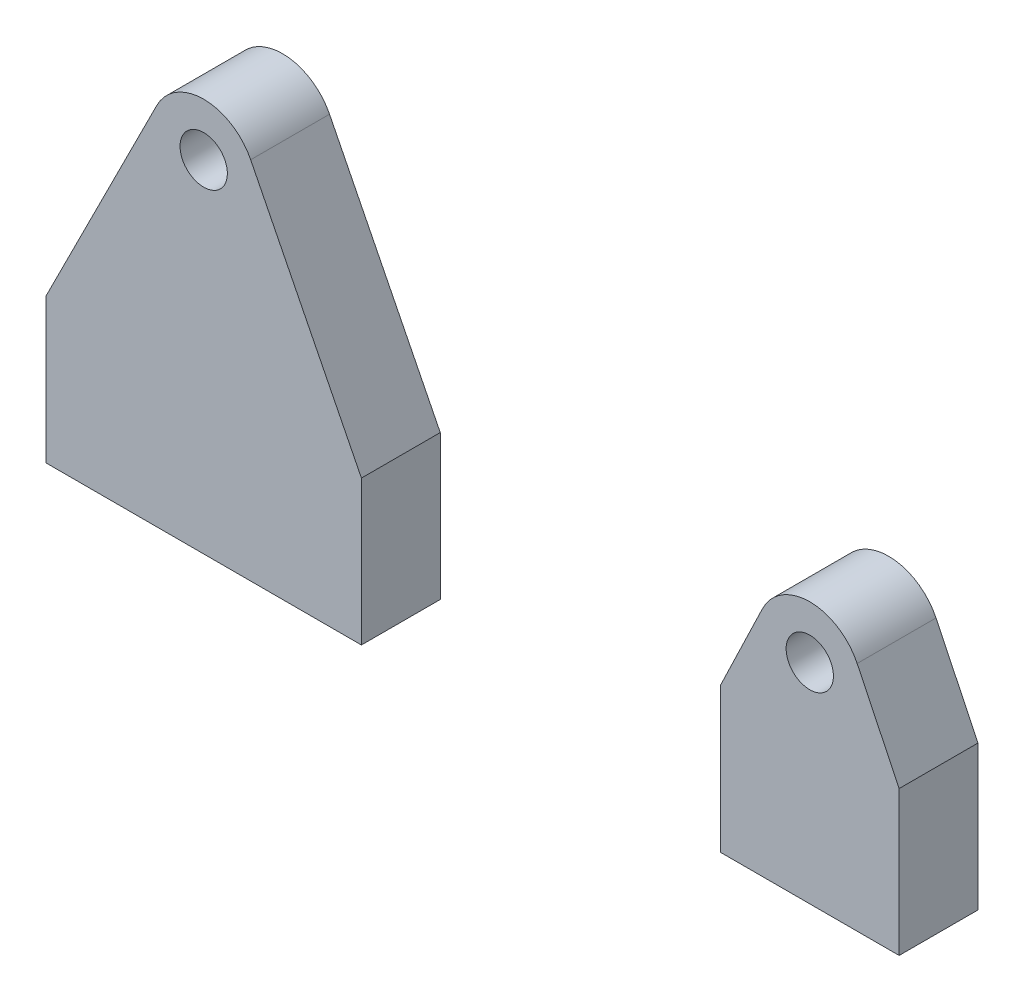
ISO-10303-21;
HEADER;
FILE_DESCRIPTION(('STEP AP214'),'2;1');
FILE_NAME('part.step','',(''),(''),'','','');
FILE_SCHEMA(('AUTOMOTIVE_DESIGN { 1 0 10303 214 1 1 1 1 }'));
ENDSEC;
DATA;
#1=APPLICATION_CONTEXT('core data for automotive mechanical design processes');
#2=APPLICATION_PROTOCOL_DEFINITION('international standard','automotive_design',2000,#1);
#3=PRODUCT_CONTEXT('',#1,'mechanical');
#4=PRODUCT('Part','Part','',(#3));
#5=PRODUCT_RELATED_PRODUCT_CATEGORY('part','',(#4));
#6=PRODUCT_DEFINITION_FORMATION('','',#4);
#7=PRODUCT_DEFINITION_CONTEXT('part definition',#1,'design');
#8=PRODUCT_DEFINITION('design','',#6,#7);
#9=PRODUCT_DEFINITION_SHAPE('','',#8);
#10=(LENGTH_UNIT() NAMED_UNIT(*) SI_UNIT(.MILLI.,.METRE.));
#11=(NAMED_UNIT(*) PLANE_ANGLE_UNIT() SI_UNIT($,.RADIAN.));
#12=(NAMED_UNIT(*) SI_UNIT($,.STERADIAN.) SOLID_ANGLE_UNIT());
#13=UNCERTAINTY_MEASURE_WITH_UNIT(LENGTH_MEASURE(1.E-05),#10,'distance_accuracy_value','');
#14=(GEOMETRIC_REPRESENTATION_CONTEXT(3) GLOBAL_UNCERTAINTY_ASSIGNED_CONTEXT((#13)) GLOBAL_UNIT_ASSIGNED_CONTEXT((#10,
#11,#12)) REPRESENTATION_CONTEXT('',''));
#15=CARTESIAN_POINT('',(0.,0.,0.));
#16=DIRECTION('',(0.,0.,1.));
#17=DIRECTION('',(1.,0.,0.));
#18=AXIS2_PLACEMENT_3D('',#15,#16,#17);
#19=CARTESIAN_POINT('',(-242.040783087782,121.65323336903,-75.0000000000001));
#20=DIRECTION('',(-0.893490787116088,0.449081521929675,0.));
#21=DIRECTION('',(-0.449081521929675,-0.893490787116088,0.));
#22=AXIS2_PLACEMENT_3D('',#19,#20,#21);
#23=PLANE('',#22);
#24=DIRECTION('',(-0.449081521929675,-0.893490787116088,0.));
#25=VECTOR('',#24,1.);
#26=CARTESIAN_POINT('',(-242.040783087782,121.65323336903,-60.0000000000001));
#27=LINE('',#26,#25);
#28=CARTESIAN_POINT('',(-560.237622534689,-511.429916687164,-60.));
#29=VERTEX_POINT('',#28);
#30=CARTESIAN_POINT('',(-581.302714663528,-553.340939135816,-60.));
#31=VERTEX_POINT('',#30);
#32=EDGE_CURVE('E141',#29,#31,#27,.T.);
#33=ORIENTED_EDGE('',*,*,#32,.F.);
#34=DIRECTION('',(0.,0.,1.));
#35=VECTOR('',#34,1.);
#36=CARTESIAN_POINT('',(-560.237622534689,-511.429916687164,-75.));
#37=LINE('',#36,#35);
#38=CARTESIAN_POINT('',(-560.237622534689,-511.429916687164,-75.));
#39=VERTEX_POINT('',#38);
#40=EDGE_CURVE('E12',#39,#29,#37,.T.);
#41=ORIENTED_EDGE('',*,*,#40,.F.);
#42=DIRECTION('',(-0.449081521929675,-0.893490787116088,0.));
#43=VECTOR('',#42,1.);
#44=CARTESIAN_POINT('',(-242.040783087782,121.65323336903,-75.0000000000001));
#45=LINE('',#44,#43);
#46=CARTESIAN_POINT('',(-581.302714663528,-553.340939135816,-75.));
#47=VERTEX_POINT('',#46);
#48=EDGE_CURVE('E157',#39,#47,#45,.T.);
#49=ORIENTED_EDGE('',*,*,#48,.T.);
#50=DIRECTION('',(0.,0.,1.));
#51=VECTOR('',#50,1.);
#52=CARTESIAN_POINT('',(-581.302714663528,-553.340939135816,-75.));
#53=LINE('',#52,#51);
#54=EDGE_CURVE('E70',#47,#31,#53,.T.);
#55=ORIENTED_EDGE('',*,*,#54,.T.);
#56=EDGE_LOOP('',(#33,#41,#49,#55));
#57=FACE_BOUND('',#56,.T.);
#58=ADVANCED_FACE('F54',(#57),#23,.T.);
#59=CARTESIAN_POINT('',(-551.302714663528,-515.92073190646,-75.));
#60=DIRECTION('',(0.,0.,1.));
#61=DIRECTION('',(0.,-1.,0.));
#62=AXIS2_PLACEMENT_3D('',#59,#60,#61);
#63=CYLINDRICAL_SURFACE('',#62,9.99999999999998);
#64=CARTESIAN_POINT('',(-551.302714663528,-515.92073190646,-60.));
#65=DIRECTION('',(0.,0.,-1.));
#66=DIRECTION('',(0.,1.,0.));
#67=AXIS2_PLACEMENT_3D('',#64,#65,#66);
#68=CIRCLE('',#67,9.99999999999998);
#69=CARTESIAN_POINT('',(-542.367806792368,-511.429916687164,-60.));
#70=VERTEX_POINT('',#69);
#71=EDGE_CURVE('E143',#29,#70,#68,.T.);
#72=ORIENTED_EDGE('',*,*,#71,.T.);
#73=DIRECTION('',(0.,0.,1.));
#74=VECTOR('',#73,1.);
#75=CARTESIAN_POINT('',(-542.367806792368,-511.429916687164,-75.));
#76=LINE('',#75,#74);
#77=CARTESIAN_POINT('',(-542.367806792368,-511.429916687164,-75.));
#78=VERTEX_POINT('',#77);
#79=EDGE_CURVE('E62',#78,#70,#76,.T.);
#80=ORIENTED_EDGE('',*,*,#79,.F.);
#81=CARTESIAN_POINT('',(-551.302714663528,-515.92073190646,-75.));
#82=DIRECTION('',(0.,0.,-1.));
#83=DIRECTION('',(0.,1.,0.));
#84=AXIS2_PLACEMENT_3D('',#81,#82,#83);
#85=CIRCLE('',#84,9.99999999999998);
#86=EDGE_CURVE('E133',#39,#78,#85,.T.);
#87=ORIENTED_EDGE('',*,*,#86,.F.);
#88=ORIENTED_EDGE('',*,*,#40,.T.);
#89=EDGE_LOOP('',(#72,#80,#87,#88));
#90=FACE_BOUND('',#89,.T.);
#91=ADVANCED_FACE('F182',(#90),#63,.T.);
#92=CARTESIAN_POINT('',(-638.197563656791,-320.76741843513,-75.));
#93=DIRECTION('',(-0.893490787116089,-0.449081521929673,0.));
#94=DIRECTION('',(0.449081521929673,-0.89349078711609,0.));
#95=AXIS2_PLACEMENT_3D('',#92,#93,#94);
#96=PLANE('',#95);
#97=DIRECTION('',(0.449081521929673,-0.89349078711609,0.));
#98=VECTOR('',#97,1.);
#99=CARTESIAN_POINT('',(-638.197563656791,-320.76741843513,-60.));
#100=LINE('',#99,#98);
#101=CARTESIAN_POINT('',(-521.302714663528,-553.340939135816,-60.));
#102=VERTEX_POINT('',#101);
#103=EDGE_CURVE('E145',#70,#102,#100,.T.);
#104=ORIENTED_EDGE('',*,*,#103,.T.);
#105=DIRECTION('',(0.,0.,1.));
#106=VECTOR('',#105,1.);
#107=CARTESIAN_POINT('',(-521.302714663528,-553.340939135816,-75.));
#108=LINE('',#107,#106);
#109=CARTESIAN_POINT('',(-521.302714663528,-553.340939135816,-75.));
#110=VERTEX_POINT('',#109);
#111=EDGE_CURVE('E118',#110,#102,#108,.T.);
#112=ORIENTED_EDGE('',*,*,#111,.F.);
#113=DIRECTION('',(0.449081521929673,-0.89349078711609,0.));
#114=VECTOR('',#113,1.);
#115=CARTESIAN_POINT('',(-638.197563656791,-320.76741843513,-75.));
#116=LINE('',#115,#114);
#117=EDGE_CURVE('E130',#78,#110,#116,.T.);
#118=ORIENTED_EDGE('',*,*,#117,.F.);
#119=ORIENTED_EDGE('',*,*,#79,.T.);
#120=EDGE_LOOP('',(#104,#112,#118,#119));
#121=FACE_BOUND('',#120,.T.);
#122=ADVANCED_FACE('F164',(#121),#96,.F.);
#123=CARTESIAN_POINT('',(-521.302714663528,0.,-75.0000000000001));
#124=DIRECTION('',(1.,0.,0.));
#125=DIRECTION('',(0.,0.,-1.));
#126=AXIS2_PLACEMENT_3D('',#123,#124,#125);
#127=PLANE('',#126);
#128=DIRECTION('',(0.,1.,0.));
#129=VECTOR('',#128,1.);
#130=CARTESIAN_POINT('',(-521.302714663528,0.,-60.0000000000001));
#131=LINE('',#130,#129);
#132=CARTESIAN_POINT('',(-521.302714663528,-580.840939135816,-60.));
#133=VERTEX_POINT('',#132);
#134=EDGE_CURVE('E115',#133,#102,#131,.T.);
#135=ORIENTED_EDGE('',*,*,#134,.F.);
#136=DIRECTION('',(0.,0.,1.));
#137=VECTOR('',#136,1.);
#138=CARTESIAN_POINT('',(-521.302714663528,-580.840939135816,-75.));
#139=LINE('',#138,#137);
#140=CARTESIAN_POINT('',(-521.302714663528,-580.840939135816,-75.));
#141=VERTEX_POINT('',#140);
#142=EDGE_CURVE('E109',#141,#133,#139,.T.);
#143=ORIENTED_EDGE('',*,*,#142,.F.);
#144=DIRECTION('',(0.,1.,0.));
#145=VECTOR('',#144,1.);
#146=CARTESIAN_POINT('',(-521.302714663528,0.,-75.0000000000001));
#147=LINE('',#146,#145);
#148=EDGE_CURVE('E113',#141,#110,#147,.T.);
#149=ORIENTED_EDGE('',*,*,#148,.T.);
#150=ORIENTED_EDGE('',*,*,#111,.T.);
#151=EDGE_LOOP('',(#135,#143,#149,#150));
#152=FACE_BOUND('',#151,.T.);
#153=ADVANCED_FACE('F111',(#152),#127,.T.);
#154=CARTESIAN_POINT('',(0.,-580.840939135816,-75.));
#155=DIRECTION('',(0.,1.,0.));
#156=DIRECTION('',(0.,0.,1.));
#157=AXIS2_PLACEMENT_3D('',#154,#155,#156);
#158=PLANE('',#157);
#159=DIRECTION('',(-1.,0.,0.));
#160=VECTOR('',#159,1.);
#161=CARTESIAN_POINT('',(0.,-580.840939135816,-60.));
#162=LINE('',#161,#160);
#163=CARTESIAN_POINT('',(-581.302714663529,-580.840939135816,-60.));
#164=VERTEX_POINT('',#163);
#165=EDGE_CURVE('E149',#133,#164,#162,.T.);
#166=ORIENTED_EDGE('',*,*,#165,.T.);
#167=DIRECTION('',(0.,0.,1.));
#168=VECTOR('',#167,1.);
#169=CARTESIAN_POINT('',(-581.302714663529,-580.840939135816,-75.));
#170=LINE('',#169,#168);
#171=CARTESIAN_POINT('',(-581.302714663529,-580.840939135816,-75.));
#172=VERTEX_POINT('',#171);
#173=EDGE_CURVE('E90',#172,#164,#170,.T.);
#174=ORIENTED_EDGE('',*,*,#173,.F.);
#175=DIRECTION('',(-1.,0.,0.));
#176=VECTOR('',#175,1.);
#177=CARTESIAN_POINT('',(0.,-580.840939135816,-75.));
#178=LINE('',#177,#176);
#179=EDGE_CURVE('E120',#141,#172,#178,.T.);
#180=ORIENTED_EDGE('',*,*,#179,.F.);
#181=ORIENTED_EDGE('',*,*,#142,.T.);
#182=EDGE_LOOP('',(#166,#174,#180,#181));
#183=FACE_BOUND('',#182,.T.);
#184=ADVANCED_FACE('F121',(#183),#158,.F.);
#185=CARTESIAN_POINT('',(-581.302714663526,2.14113233565818E-12,-75.0000000000001));
#186=DIRECTION('',(-1.,0.,0.));
#187=DIRECTION('',(0.,-1.,0.));
#188=AXIS2_PLACEMENT_3D('',#185,#186,#187);
#189=PLANE('',#188);
#190=DIRECTION('',(0.,-1.,0.));
#191=VECTOR('',#190,1.);
#192=CARTESIAN_POINT('',(-581.302714663526,2.14321420711725E-12,-60.0000000000001));
#193=LINE('',#192,#191);
#194=EDGE_CURVE('E151',#31,#164,#193,.T.);
#195=ORIENTED_EDGE('',*,*,#194,.F.);
#196=ORIENTED_EDGE('',*,*,#54,.F.);
#197=DIRECTION('',(0.,-1.,0.));
#198=VECTOR('',#197,1.);
#199=CARTESIAN_POINT('',(-581.302714663526,2.14113233565818E-12,-75.0000000000001));
#200=LINE('',#199,#198);
#201=EDGE_CURVE('E124',#47,#172,#200,.T.);
#202=ORIENTED_EDGE('',*,*,#201,.T.);
#203=ORIENTED_EDGE('',*,*,#173,.T.);
#204=EDGE_LOOP('',(#195,#196,#202,#203));
#205=FACE_BOUND('',#204,.T.);
#206=ADVANCED_FACE('F170',(#205),#189,.T.);
#207=CARTESIAN_POINT('',(-551.302714663526,-515.92073190647,-75.));
#208=DIRECTION('',(0.,0.,1.));
#209=DIRECTION('',(0.,-1.,0.));
#210=AXIS2_PLACEMENT_3D('',#207,#208,#209);
#211=CYLINDRICAL_SURFACE('',#210,4.49999999999894);
#212=CARTESIAN_POINT('',(-551.302714663526,-515.92073190647,-75.));
#213=DIRECTION('',(0.,0.,-1.));
#214=DIRECTION('',(0.,1.,0.));
#215=AXIS2_PLACEMENT_3D('',#212,#213,#214);
#216=CIRCLE('',#215,4.49999999999894);
#217=CARTESIAN_POINT('',(-551.302714663526,-511.420731906471,-75.));
#218=VERTEX_POINT('',#217);
#219=EDGE_CURVE('E138',#218,#218,#216,.T.);
#220=ORIENTED_EDGE('',*,*,#219,.T.);
#221=EDGE_LOOP('',(#220));
#222=FACE_BOUND('',#221,.T.);
#223=CARTESIAN_POINT('',(-551.302714663526,-515.92073190647,-60.));
#224=DIRECTION('',(0.,0.,-1.));
#225=DIRECTION('',(0.,1.,0.));
#226=AXIS2_PLACEMENT_3D('',#223,#224,#225);
#227=CIRCLE('',#226,4.49999999999894);
#228=CARTESIAN_POINT('',(-551.302714663526,-511.420731906471,-60.));
#229=VERTEX_POINT('',#228);
#230=EDGE_CURVE('E154',#229,#229,#227,.T.);
#231=ORIENTED_EDGE('',*,*,#230,.F.);
#232=EDGE_LOOP('',(#231));
#233=FACE_BOUND('',#232,.T.);
#234=ADVANCED_FACE('F172',(#222,#233),#211,.F.);
#235=CARTESIAN_POINT('',(0.,0.,-75.0000000000001));
#236=DIRECTION('',(0.,0.,-1.));
#237=DIRECTION('',(0.,1.,0.));
#238=AXIS2_PLACEMENT_3D('',#235,#236,#237);
#239=PLANE('',#238);
#240=ORIENTED_EDGE('',*,*,#48,.F.);
#241=ORIENTED_EDGE('',*,*,#86,.T.);
#242=ORIENTED_EDGE('',*,*,#117,.T.);
#243=ORIENTED_EDGE('',*,*,#148,.F.);
#244=ORIENTED_EDGE('',*,*,#179,.T.);
#245=ORIENTED_EDGE('',*,*,#201,.F.);
#246=EDGE_LOOP('',(#240,#241,#242,#243,#244,#245));
#247=FACE_BOUND('',#246,.T.);
#248=ORIENTED_EDGE('',*,*,#219,.F.);
#249=EDGE_LOOP('',(#248));
#250=FACE_BOUND('',#249,.T.);
#251=ADVANCED_FACE('F127',(#247,#250),#239,.T.);
#252=CARTESIAN_POINT('',(0.,0.,-60.0000000000001));
#253=DIRECTION('',(0.,0.,-1.));
#254=DIRECTION('',(0.,1.,0.));
#255=AXIS2_PLACEMENT_3D('',#252,#253,#254);
#256=PLANE('',#255);
#257=ORIENTED_EDGE('',*,*,#32,.T.);
#258=ORIENTED_EDGE('',*,*,#194,.T.);
#259=ORIENTED_EDGE('',*,*,#165,.F.);
#260=ORIENTED_EDGE('',*,*,#134,.T.);
#261=ORIENTED_EDGE('',*,*,#103,.F.);
#262=ORIENTED_EDGE('',*,*,#71,.F.);
#263=EDGE_LOOP('',(#257,#258,#259,#260,#261,#262));
#264=FACE_BOUND('',#263,.T.);
#265=ORIENTED_EDGE('',*,*,#230,.T.);
#266=EDGE_LOOP('',(#265));
#267=FACE_BOUND('',#266,.T.);
#268=ADVANCED_FACE('F168',(#264,#267),#256,.F.);
#269=CLOSED_SHELL('',(#58,#91,#122,#153,#184,#206,#234,#251,#268));
#270=MANIFOLD_SOLID_BREP('B2',#269);
#271=CARTESIAN_POINT('',(-436.012687073929,-541.064646672395,-75.));
#272=DIRECTION('',(0.,0.,1.));
#273=DIRECTION('',(0.,-1.,0.));
#274=AXIS2_PLACEMENT_3D('',#271,#272,#273);
#275=CYLINDRICAL_SURFACE('',#274,10.);
#276=CARTESIAN_POINT('',(-436.012687073929,-541.064646672395,-60.));
#277=DIRECTION('',(0.,0.,-1.));
#278=DIRECTION('',(0.,1.,0.));
#279=AXIS2_PLACEMENT_3D('',#276,#277,#278);
#280=CIRCLE('',#279,10.);
#281=CARTESIAN_POINT('',(-445.024731196793,-536.730703810802,-60.));
#282=VERTEX_POINT('',#281);
#283=CARTESIAN_POINT('',(-427.000642951065,-536.730703810801,-60.));
#284=VERTEX_POINT('',#283);
#285=EDGE_CURVE('E392',#282,#284,#280,.T.);
#286=ORIENTED_EDGE('',*,*,#285,.T.);
#287=DIRECTION('',(0.,0.,1.));
#288=VECTOR('',#287,1.);
#289=CARTESIAN_POINT('',(-427.000642951065,-536.730703810801,-75.));
#290=LINE('',#289,#288);
#291=CARTESIAN_POINT('',(-427.000642951065,-536.730703810801,-75.));
#292=VERTEX_POINT('',#291);
#293=EDGE_CURVE('E52',#292,#284,#290,.T.);
#294=ORIENTED_EDGE('',*,*,#293,.F.);
#295=CARTESIAN_POINT('',(-436.012687073929,-541.064646672395,-75.));
#296=DIRECTION('',(0.,0.,-1.));
#297=DIRECTION('',(0.,1.,0.));
#298=AXIS2_PLACEMENT_3D('',#295,#296,#297);
#299=CIRCLE('',#298,10.);
#300=CARTESIAN_POINT('',(-445.024731196793,-536.730703810802,-75.));
#301=VERTEX_POINT('',#300);
#302=EDGE_CURVE('E552',#301,#292,#299,.T.);
#303=ORIENTED_EDGE('',*,*,#302,.F.);
#304=DIRECTION('',(0.,0.,1.));
#305=VECTOR('',#304,1.);
#306=CARTESIAN_POINT('',(-445.024731196793,-536.730703810802,-75.));
#307=LINE('',#306,#305);
#308=EDGE_CURVE('E321',#301,#282,#307,.T.);
#309=ORIENTED_EDGE('',*,*,#308,.T.);
#310=EDGE_LOOP('',(#286,#294,#303,#309));
#311=FACE_BOUND('',#310,.T.);
#312=ADVANCED_FACE('F304',(#311),#275,.T.);
#313=CARTESIAN_POINT('',(-556.431436685388,-267.591017100216,-75.));
#314=DIRECTION('',(-0.901204412286354,-0.433394286159391,0.));
#315=DIRECTION('',(0.433394286159391,-0.901204412286354,0.));
#316=AXIS2_PLACEMENT_3D('',#313,#314,#315);
#317=PLANE('',#316);
#318=DIRECTION('',(0.433394286159391,-0.901204412286354,0.));
#319=VECTOR('',#318,1.);
#320=CARTESIAN_POINT('',(-556.431436685388,-267.591017100216,-60.));
#321=LINE('',#320,#319);
#322=CARTESIAN_POINT('',(-419.012687073929,-553.340939135816,-60.));
#323=VERTEX_POINT('',#322);
#324=EDGE_CURVE('E394',#284,#323,#321,.T.);
#325=ORIENTED_EDGE('',*,*,#324,.T.);
#326=DIRECTION('',(0.,0.,1.));
#327=VECTOR('',#326,1.);
#328=CARTESIAN_POINT('',(-419.012687073929,-553.340939135816,-75.));
#329=LINE('',#328,#327);
#330=CARTESIAN_POINT('',(-419.012687073929,-553.340939135816,-75.));
#331=VERTEX_POINT('',#330);
#332=EDGE_CURVE('E313',#331,#323,#329,.T.);
#333=ORIENTED_EDGE('',*,*,#332,.F.);
#334=DIRECTION('',(0.433394286159391,-0.901204412286354,0.));
#335=VECTOR('',#334,1.);
#336=CARTESIAN_POINT('',(-556.431436685388,-267.591017100216,-75.));
#337=LINE('',#336,#335);
#338=EDGE_CURVE('E353',#292,#331,#337,.T.);
#339=ORIENTED_EDGE('',*,*,#338,.F.);
#340=ORIENTED_EDGE('',*,*,#293,.T.);
#341=EDGE_LOOP('',(#325,#333,#339,#340));
#342=FACE_BOUND('',#341,.T.);
#343=ADVANCED_FACE('F412',(#342),#317,.F.);
#344=CARTESIAN_POINT('',(-419.012687073929,0.,-75.0000000000001));
#345=DIRECTION('',(1.,0.,0.));
#346=DIRECTION('',(0.,0.,-1.));
#347=AXIS2_PLACEMENT_3D('',#344,#345,#346);
#348=PLANE('',#347);
#349=DIRECTION('',(0.,1.,0.));
#350=VECTOR('',#349,1.);
#351=CARTESIAN_POINT('',(-419.012687073929,0.,-60.0000000000001));
#352=LINE('',#351,#350);
#353=CARTESIAN_POINT('',(-419.012687073929,-580.840939135816,-60.));
#354=VERTEX_POINT('',#353);
#355=EDGE_CURVE('E397',#354,#323,#352,.T.);
#356=ORIENTED_EDGE('',*,*,#355,.F.);
#357=DIRECTION('',(0.,0.,1.));
#358=VECTOR('',#357,1.);
#359=CARTESIAN_POINT('',(-419.012687073929,-580.840939135816,-75.));
#360=LINE('',#359,#358);
#361=CARTESIAN_POINT('',(-419.012687073929,-580.840939135816,-75.));
#362=VERTEX_POINT('',#361);
#363=EDGE_CURVE('E381',#362,#354,#360,.T.);
#364=ORIENTED_EDGE('',*,*,#363,.F.);
#365=DIRECTION('',(0.,1.,0.));
#366=VECTOR('',#365,1.);
#367=CARTESIAN_POINT('',(-419.012687073929,0.,-75.0000000000001));
#368=LINE('',#367,#366);
#369=EDGE_CURVE('E371',#362,#331,#368,.T.);
#370=ORIENTED_EDGE('',*,*,#369,.T.);
#371=ORIENTED_EDGE('',*,*,#332,.T.);
#372=EDGE_LOOP('',(#356,#364,#370,#371));
#373=FACE_BOUND('',#372,.T.);
#374=ADVANCED_FACE('F411',(#373),#348,.T.);
#375=CARTESIAN_POINT('',(0.,-580.840939135816,-75.));
#376=DIRECTION('',(0.,1.,0.));
#377=DIRECTION('',(0.,0.,1.));
#378=AXIS2_PLACEMENT_3D('',#375,#376,#377);
#379=PLANE('',#378);
#380=DIRECTION('',(-1.,0.,0.));
#381=VECTOR('',#380,1.);
#382=CARTESIAN_POINT('',(0.,-580.840939135816,-60.));
#383=LINE('',#382,#381);
#384=CARTESIAN_POINT('',(-453.012687073929,-580.840939135816,-60.));
#385=VERTEX_POINT('',#384);
#386=EDGE_CURVE('E378',#354,#385,#383,.T.);
#387=ORIENTED_EDGE('',*,*,#386,.T.);
#388=DIRECTION('',(0.,0.,1.));
#389=VECTOR('',#388,1.);
#390=CARTESIAN_POINT('',(-453.012687073929,-580.840939135816,-75.));
#391=LINE('',#390,#389);
#392=CARTESIAN_POINT('',(-453.012687073929,-580.840939135816,-75.));
#393=VERTEX_POINT('',#392);
#394=EDGE_CURVE('E375',#393,#385,#391,.T.);
#395=ORIENTED_EDGE('',*,*,#394,.F.);
#396=DIRECTION('',(-1.,0.,0.));
#397=VECTOR('',#396,1.);
#398=CARTESIAN_POINT('',(0.,-580.840939135816,-75.));
#399=LINE('',#398,#397);
#400=EDGE_CURVE('E364',#362,#393,#399,.T.);
#401=ORIENTED_EDGE('',*,*,#400,.F.);
#402=ORIENTED_EDGE('',*,*,#363,.T.);
#403=EDGE_LOOP('',(#387,#395,#401,#402));
#404=FACE_BOUND('',#403,.T.);
#405=ADVANCED_FACE('F376',(#404),#379,.F.);
#406=CARTESIAN_POINT('',(-453.01268707393,-9.24565522791175E-13,-75.0000000000001));
#407=DIRECTION('',(-1.,0.,0.));
#408=DIRECTION('',(0.,-1.,0.));
#409=AXIS2_PLACEMENT_3D('',#406,#407,#408);
#410=PLANE('',#409);
#411=DIRECTION('',(0.,-1.,0.));
#412=VECTOR('',#411,1.);
#413=CARTESIAN_POINT('',(-453.01268707393,-9.22483651332095E-13,-60.0000000000001));
#414=LINE('',#413,#412);
#415=CARTESIAN_POINT('',(-453.012687073929,-553.340939135816,-60.));
#416=VERTEX_POINT('',#415);
#417=EDGE_CURVE('E401',#416,#385,#414,.T.);
#418=ORIENTED_EDGE('',*,*,#417,.F.);
#419=DIRECTION('',(0.,0.,1.));
#420=VECTOR('',#419,1.);
#421=CARTESIAN_POINT('',(-453.012687073929,-553.340939135816,-75.));
#422=LINE('',#421,#420);
#423=CARTESIAN_POINT('',(-453.012687073929,-553.340939135816,-75.));
#424=VERTEX_POINT('',#423);
#425=EDGE_CURVE('E341',#424,#416,#422,.T.);
#426=ORIENTED_EDGE('',*,*,#425,.F.);
#427=DIRECTION('',(0.,-1.,0.));
#428=VECTOR('',#427,1.);
#429=CARTESIAN_POINT('',(-453.01268707393,-9.24565522791175E-13,-75.0000000000001));
#430=LINE('',#429,#428);
#431=EDGE_CURVE('E369',#424,#393,#430,.T.);
#432=ORIENTED_EDGE('',*,*,#431,.T.);
#433=ORIENTED_EDGE('',*,*,#394,.T.);
#434=EDGE_LOOP('',(#418,#426,#432,#433));
#435=FACE_BOUND('',#434,.T.);
#436=ADVANCED_FACE('F383',(#435),#410,.T.);
#437=CARTESIAN_POINT('',(-436.012687073919,-541.064646672413,-75.));
#438=DIRECTION('',(0.,0.,1.));
#439=DIRECTION('',(0.,-1.,0.));
#440=AXIS2_PLACEMENT_3D('',#437,#438,#439);
#441=CYLINDRICAL_SURFACE('',#440,4.49999999999891);
#442=CARTESIAN_POINT('',(-436.012687073919,-541.064646672413,-75.));
#443=DIRECTION('',(0.,0.,-1.));
#444=DIRECTION('',(0.,1.,0.));
#445=AXIS2_PLACEMENT_3D('',#442,#443,#444);
#446=CIRCLE('',#445,4.49999999999891);
#447=CARTESIAN_POINT('',(-436.012687073919,-536.564646672414,-75.));
#448=VERTEX_POINT('',#447);
#449=EDGE_CURVE('E406',#448,#448,#446,.T.);
#450=ORIENTED_EDGE('',*,*,#449,.T.);
#451=EDGE_LOOP('',(#450));
#452=FACE_BOUND('',#451,.T.);
#453=CARTESIAN_POINT('',(-436.012687073919,-541.064646672413,-60.));
#454=DIRECTION('',(0.,0.,-1.));
#455=DIRECTION('',(0.,1.,0.));
#456=AXIS2_PLACEMENT_3D('',#453,#454,#455);
#457=CIRCLE('',#456,4.49999999999891);
#458=CARTESIAN_POINT('',(-436.012687073919,-536.564646672414,-60.));
#459=VERTEX_POINT('',#458);
#460=EDGE_CURVE('E389',#459,#459,#457,.T.);
#461=ORIENTED_EDGE('',*,*,#460,.F.);
#462=EDGE_LOOP('',(#461));
#463=FACE_BOUND('',#462,.T.);
#464=ADVANCED_FACE('F306',(#452,#463),#441,.F.);
#465=CARTESIAN_POINT('',(-151.800881876543,73.0019005037283,-75.0000000000001));
#466=DIRECTION('',(-0.901204412286356,0.433394286159385,0.));
#467=DIRECTION('',(-0.433394286159386,-0.901204412286356,0.));
#468=AXIS2_PLACEMENT_3D('',#465,#466,#467);
#469=PLANE('',#468);
#470=DIRECTION('',(-0.433394286159386,-0.901204412286356,0.));
#471=VECTOR('',#470,1.);
#472=CARTESIAN_POINT('',(-151.800881876543,73.0019005037283,-60.0000000000001));
#473=LINE('',#472,#471);
#474=EDGE_CURVE('E403',#282,#416,#473,.T.);
#475=ORIENTED_EDGE('',*,*,#474,.F.);
#476=ORIENTED_EDGE('',*,*,#308,.F.);
#477=DIRECTION('',(-0.433394286159386,-0.901204412286356,0.));
#478=VECTOR('',#477,1.);
#479=CARTESIAN_POINT('',(-151.800881876543,73.0019005037283,-75.0000000000001));
#480=LINE('',#479,#478);
#481=EDGE_CURVE('E384',#301,#424,#480,.T.);
#482=ORIENTED_EDGE('',*,*,#481,.T.);
#483=ORIENTED_EDGE('',*,*,#425,.T.);
#484=EDGE_LOOP('',(#475,#476,#482,#483));
#485=FACE_BOUND('',#484,.T.);
#486=ADVANCED_FACE('F416',(#485),#469,.T.);
#487=CARTESIAN_POINT('',(0.,0.,-75.0000000000001));
#488=DIRECTION('',(0.,0.,-1.));
#489=DIRECTION('',(0.,1.,0.));
#490=AXIS2_PLACEMENT_3D('',#487,#488,#489);
#491=PLANE('',#490);
#492=ORIENTED_EDGE('',*,*,#449,.F.);
#493=EDGE_LOOP('',(#492));
#494=FACE_BOUND('',#493,.T.);
#495=ORIENTED_EDGE('',*,*,#302,.T.);
#496=ORIENTED_EDGE('',*,*,#338,.T.);
#497=ORIENTED_EDGE('',*,*,#369,.F.);
#498=ORIENTED_EDGE('',*,*,#400,.T.);
#499=ORIENTED_EDGE('',*,*,#431,.F.);
#500=ORIENTED_EDGE('',*,*,#481,.F.);
#501=EDGE_LOOP('',(#495,#496,#497,#498,#499,#500));
#502=FACE_BOUND('',#501,.T.);
#503=ADVANCED_FACE('F366',(#494,#502),#491,.T.);
#504=CARTESIAN_POINT('',(0.,0.,-60.0000000000001));
#505=DIRECTION('',(0.,0.,-1.));
#506=DIRECTION('',(0.,1.,0.));
#507=AXIS2_PLACEMENT_3D('',#504,#505,#506);
#508=PLANE('',#507);
#509=ORIENTED_EDGE('',*,*,#460,.T.);
#510=EDGE_LOOP('',(#509));
#511=FACE_BOUND('',#510,.T.);
#512=ORIENTED_EDGE('',*,*,#285,.F.);
#513=ORIENTED_EDGE('',*,*,#474,.T.);
#514=ORIENTED_EDGE('',*,*,#417,.T.);
#515=ORIENTED_EDGE('',*,*,#386,.F.);
#516=ORIENTED_EDGE('',*,*,#355,.T.);
#517=ORIENTED_EDGE('',*,*,#324,.F.);
#518=EDGE_LOOP('',(#512,#513,#514,#515,#516,#517));
#519=FACE_BOUND('',#518,.T.);
#520=ADVANCED_FACE('F415',(#511,#519),#508,.F.);
#521=CLOSED_SHELL('',(#312,#343,#374,#405,#436,#464,#486,#503,#520));
#522=MANIFOLD_SOLID_BREP('B6',#521);
#523=ADVANCED_BREP_SHAPE_REPRESENTATION('',(#18,#270,#522),#14);
#524=SHAPE_DEFINITION_REPRESENTATION(#9,#523);
ENDSEC;
END-ISO-10303-21;
